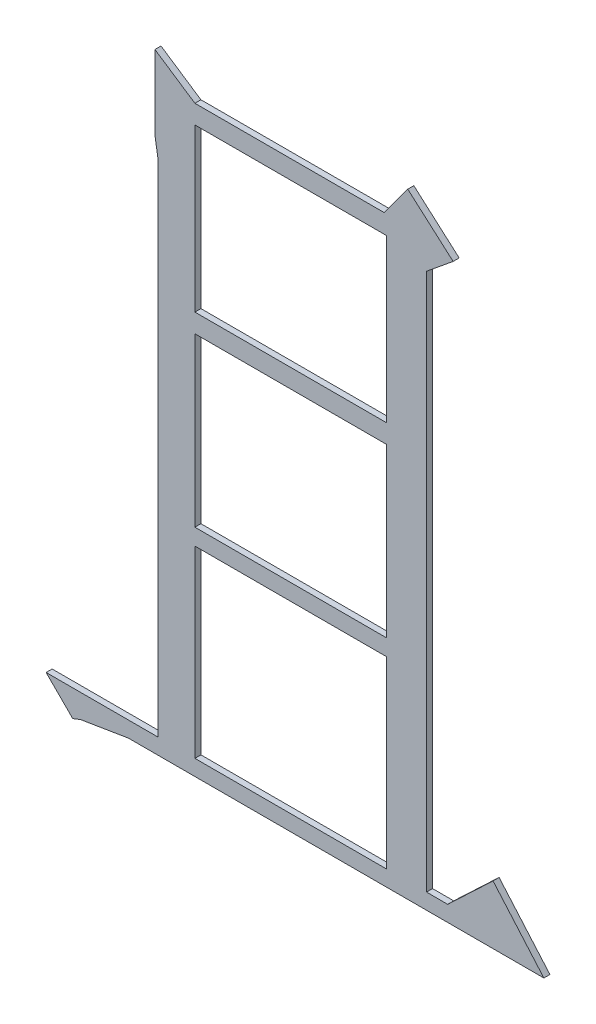
ISO-10303-21;
HEADER;
FILE_DESCRIPTION(('STEP AP214'),'2;1');
FILE_NAME('part.step','',(''),(''),'','','');
FILE_SCHEMA(('AUTOMOTIVE_DESIGN { 1 0 10303 214 1 1 1 1 }'));
ENDSEC;
DATA;
#1=APPLICATION_CONTEXT('core data for automotive mechanical design processes');
#2=APPLICATION_PROTOCOL_DEFINITION('international standard','automotive_design',2000,#1);
#3=PRODUCT_CONTEXT('',#1,'mechanical');
#4=PRODUCT('Part','Part','',(#3));
#5=PRODUCT_RELATED_PRODUCT_CATEGORY('part','',(#4));
#6=PRODUCT_DEFINITION_FORMATION('','',#4);
#7=PRODUCT_DEFINITION_CONTEXT('part definition',#1,'design');
#8=PRODUCT_DEFINITION('design','',#6,#7);
#9=PRODUCT_DEFINITION_SHAPE('','',#8);
#10=(LENGTH_UNIT() NAMED_UNIT(*) SI_UNIT(.MILLI.,.METRE.));
#11=(NAMED_UNIT(*) PLANE_ANGLE_UNIT() SI_UNIT($,.RADIAN.));
#12=(NAMED_UNIT(*) SI_UNIT($,.STERADIAN.) SOLID_ANGLE_UNIT());
#13=UNCERTAINTY_MEASURE_WITH_UNIT(LENGTH_MEASURE(1.E-05),#10,'distance_accuracy_value','');
#14=(GEOMETRIC_REPRESENTATION_CONTEXT(3) GLOBAL_UNCERTAINTY_ASSIGNED_CONTEXT((#13)) GLOBAL_UNIT_ASSIGNED_CONTEXT((#10,
#11,#12)) REPRESENTATION_CONTEXT('',''));
#15=CARTESIAN_POINT('',(0.,0.,0.));
#16=DIRECTION('',(0.,0.,1.));
#17=DIRECTION('',(1.,0.,0.));
#18=AXIS2_PLACEMENT_3D('',#15,#16,#17);
#19=CARTESIAN_POINT('',(0.,0.,0.01));
#20=DIRECTION('',(0.,0.,1.));
#21=DIRECTION('',(1.,0.,0.));
#22=AXIS2_PLACEMENT_3D('',#19,#20,#21);
#23=PLANE('',#22);
#24=DIRECTION('',(1.,0.,0.));
#25=VECTOR('',#24,1.);
#26=CARTESIAN_POINT('',(1.623,-0.015,0.01));
#27=LINE('',#26,#25);
#28=CARTESIAN_POINT('',(1.306,-0.015,0.01));
#29=VERTEX_POINT('',#28);
#30=CARTESIAN_POINT('',(1.623,-0.015,0.01));
#31=VERTEX_POINT('',#30);
#32=EDGE_CURVE('E335',#29,#31,#27,.T.);
#33=ORIENTED_EDGE('',*,*,#32,.F.);
#34=DIRECTION('',(0.,1.,0.));
#35=VECTOR('',#34,1.);
#36=CARTESIAN_POINT('',(1.306,-0.015,0.01));
#37=LINE('',#36,#35);
#38=CARTESIAN_POINT('',(1.306,0.262,0.01));
#39=VERTEX_POINT('',#38);
#40=EDGE_CURVE('E322',#39,#29,#37,.F.);
#41=ORIENTED_EDGE('',*,*,#40,.F.);
#42=DIRECTION('',(1.,0.,0.));
#43=VECTOR('',#42,1.);
#44=CARTESIAN_POINT('',(1.306,0.262,0.01));
#45=LINE('',#44,#43);
#46=CARTESIAN_POINT('',(1.623,0.262,0.01));
#47=VERTEX_POINT('',#46);
#48=EDGE_CURVE('E324',#47,#39,#45,.F.);
#49=ORIENTED_EDGE('',*,*,#48,.F.);
#50=DIRECTION('',(0.,1.,0.));
#51=VECTOR('',#50,1.);
#52=CARTESIAN_POINT('',(1.623,0.262,0.01));
#53=LINE('',#52,#51);
#54=EDGE_CURVE('E328',#31,#47,#53,.T.);
#55=ORIENTED_EDGE('',*,*,#54,.F.);
#56=EDGE_LOOP('',(#33,#41,#49,#55));
#57=FACE_BOUND('',#56,.T.);
#58=DIRECTION('',(1.,0.,0.));
#59=VECTOR('',#58,1.);
#60=CARTESIAN_POINT('',(1.623,-0.346,0.01));
#61=LINE('',#60,#59);
#62=CARTESIAN_POINT('',(1.306,-0.346,0.01));
#63=VERTEX_POINT('',#62);
#64=CARTESIAN_POINT('',(1.623,-0.346,0.01));
#65=VERTEX_POINT('',#64);
#66=EDGE_CURVE('E318',#63,#65,#61,.T.);
#67=ORIENTED_EDGE('',*,*,#66,.F.);
#68=DIRECTION('',(0.,1.,0.));
#69=VECTOR('',#68,1.);
#70=CARTESIAN_POINT('',(1.306,-0.346,0.01));
#71=LINE('',#70,#69);
#72=CARTESIAN_POINT('',(1.306,-0.042,0.01));
#73=VERTEX_POINT('',#72);
#74=EDGE_CURVE('E305',#73,#63,#71,.F.);
#75=ORIENTED_EDGE('',*,*,#74,.F.);
#76=DIRECTION('',(1.,0.,0.));
#77=VECTOR('',#76,1.);
#78=CARTESIAN_POINT('',(1.306,-0.042,0.01));
#79=LINE('',#78,#77);
#80=CARTESIAN_POINT('',(1.623,-0.042,0.01));
#81=VERTEX_POINT('',#80);
#82=EDGE_CURVE('E307',#81,#73,#79,.F.);
#83=ORIENTED_EDGE('',*,*,#82,.F.);
#84=DIRECTION('',(0.,1.,0.));
#85=VECTOR('',#84,1.);
#86=CARTESIAN_POINT('',(1.623,-0.042,0.01));
#87=LINE('',#86,#85);
#88=EDGE_CURVE('E311',#65,#81,#87,.T.);
#89=ORIENTED_EDGE('',*,*,#88,.F.);
#90=EDGE_LOOP('',(#67,#75,#83,#89));
#91=FACE_BOUND('',#90,.T.);
#92=DIRECTION('',(1.,0.,0.));
#93=VECTOR('',#92,1.);
#94=CARTESIAN_POINT('',(1.623,0.293,0.01));
#95=LINE('',#94,#93);
#96=CARTESIAN_POINT('',(1.306,0.293,0.01));
#97=VERTEX_POINT('',#96);
#98=CARTESIAN_POINT('',(1.623,0.293,0.01));
#99=VERTEX_POINT('',#98);
#100=EDGE_CURVE('E301',#97,#99,#95,.T.);
#101=ORIENTED_EDGE('',*,*,#100,.F.);
#102=DIRECTION('',(0.,1.,0.));
#103=VECTOR('',#102,1.);
#104=CARTESIAN_POINT('',(1.306,0.293,0.01));
#105=LINE('',#104,#103);
#106=CARTESIAN_POINT('',(1.306,0.561,0.01));
#107=VERTEX_POINT('',#106);
#108=EDGE_CURVE('E288',#107,#97,#105,.F.);
#109=ORIENTED_EDGE('',*,*,#108,.F.);
#110=DIRECTION('',(1.,0.,0.));
#111=VECTOR('',#110,1.);
#112=CARTESIAN_POINT('',(1.306,0.561,0.01));
#113=LINE('',#112,#111);
#114=CARTESIAN_POINT('',(1.623,0.561,0.01));
#115=VERTEX_POINT('',#114);
#116=EDGE_CURVE('E290',#115,#107,#113,.F.);
#117=ORIENTED_EDGE('',*,*,#116,.F.);
#118=DIRECTION('',(0.,1.,0.));
#119=VECTOR('',#118,1.);
#120=CARTESIAN_POINT('',(1.623,0.561,0.01));
#121=LINE('',#120,#119);
#122=EDGE_CURVE('E294',#99,#115,#121,.T.);
#123=ORIENTED_EDGE('',*,*,#122,.F.);
#124=EDGE_LOOP('',(#101,#109,#117,#123));
#125=FACE_BOUND('',#124,.T.);
#126=DIRECTION('',(0.,1.,0.));
#127=VECTOR('',#126,1.);
#128=CARTESIAN_POINT('',(1.689,-0.346,0.01));
#129=LINE('',#128,#127);
#130=CARTESIAN_POINT('',(1.689,0.543,0.01));
#131=VERTEX_POINT('',#130);
#132=CARTESIAN_POINT('',(1.689,-0.346,0.01));
#133=VERTEX_POINT('',#132);
#134=EDGE_CURVE('E220',#131,#133,#129,.F.);
#135=ORIENTED_EDGE('',*,*,#134,.F.);
#136=DIRECTION('',(0.773957299203294,0.633237790257295,0.));
#137=VECTOR('',#136,1.);
#138=CARTESIAN_POINT('',(1.689,0.543,0.01));
#139=LINE('',#138,#137);
#140=CARTESIAN_POINT('',(1.733,0.579000000000001,0.01));
#141=VERTEX_POINT('',#140);
#142=EDGE_CURVE('E20',#141,#131,#139,.F.);
#143=ORIENTED_EDGE('',*,*,#142,.F.);
#144=DIRECTION('',(-0.750713516922787,0.660627894891989,0.));
#145=VECTOR('',#144,1.);
#146=CARTESIAN_POINT('',(1.733,0.579,0.01));
#147=LINE('',#146,#145);
#148=CARTESIAN_POINT('',(1.658,0.644999999999999,0.01));
#149=VERTEX_POINT('',#148);
#150=EDGE_CURVE('E209',#149,#141,#147,.F.);
#151=ORIENTED_EDGE('',*,*,#150,.F.);
#152=DIRECTION('',(-0.592680527647196,-0.805437640135995,0.));
#153=VECTOR('',#152,1.);
#154=CARTESIAN_POINT('',(1.658,0.645,0.01));
#155=LINE('',#154,#153);
#156=CARTESIAN_POINT('',(1.619,0.592,0.01));
#157=VERTEX_POINT('',#156);
#158=EDGE_CURVE('E204',#157,#149,#155,.F.);
#159=ORIENTED_EDGE('',*,*,#158,.F.);
#160=DIRECTION('',(1.,0.,0.));
#161=VECTOR('',#160,1.);
#162=CARTESIAN_POINT('',(1.619,0.592,0.01));
#163=LINE('',#162,#161);
#164=CARTESIAN_POINT('',(1.306,0.592,0.01));
#165=VERTEX_POINT('',#164);
#166=EDGE_CURVE('E231',#165,#157,#163,.T.);
#167=ORIENTED_EDGE('',*,*,#166,.F.);
#168=DIRECTION('',(-0.832050294337844,0.554700196225229,0.));
#169=VECTOR('',#168,1.);
#170=CARTESIAN_POINT('',(1.306,0.592,0.01));
#171=LINE('',#170,#169);
#172=CARTESIAN_POINT('',(1.24,0.636,0.01));
#173=VERTEX_POINT('',#172);
#174=EDGE_CURVE('E235',#173,#165,#171,.F.);
#175=ORIENTED_EDGE('',*,*,#174,.F.);
#176=DIRECTION('',(0.,1.,0.));
#177=VECTOR('',#176,1.);
#178=CARTESIAN_POINT('',(1.24,0.636,0.01));
#179=LINE('',#178,#177);
#180=CARTESIAN_POINT('',(1.24,0.513,0.01));
#181=VERTEX_POINT('',#180);
#182=EDGE_CURVE('E239',#181,#173,#179,.T.);
#183=ORIENTED_EDGE('',*,*,#182,.F.);
#184=DIRECTION('',(0.159232438824608,-0.987241120712649,0.));
#185=VECTOR('',#184,1.);
#186=CARTESIAN_POINT('',(1.24,0.513,0.01));
#187=LINE('',#186,#185);
#188=CARTESIAN_POINT('',(1.245,0.481999999999999,0.01));
#189=VERTEX_POINT('',#188);
#190=EDGE_CURVE('E243',#189,#181,#187,.F.);
#191=ORIENTED_EDGE('',*,*,#190,.F.);
#192=DIRECTION('',(0.,1.,0.));
#193=VECTOR('',#192,1.);
#194=CARTESIAN_POINT('',(1.245,0.482,0.01));
#195=LINE('',#194,#193);
#196=CARTESIAN_POINT('',(1.245,-0.346,0.01));
#197=VERTEX_POINT('',#196);
#198=EDGE_CURVE('E247',#197,#189,#195,.T.);
#199=ORIENTED_EDGE('',*,*,#198,.F.);
#200=DIRECTION('',(1.,0.,0.));
#201=VECTOR('',#200,1.);
#202=CARTESIAN_POINT('',(1.245,-0.346,0.01));
#203=LINE('',#202,#201);
#204=CARTESIAN_POINT('',(1.06,-0.346,0.01));
#205=VERTEX_POINT('',#204);
#206=EDGE_CURVE('E251',#205,#197,#203,.T.);
#207=ORIENTED_EDGE('',*,*,#206,.F.);
#208=DIRECTION('',(0.707106781186548,-0.707106781186548,0.));
#209=VECTOR('',#208,1.);
#210=CARTESIAN_POINT('',(1.06,-0.346,0.01));
#211=LINE('',#210,#209);
#212=CARTESIAN_POINT('',(1.104,-0.39,0.01));
#213=VERTEX_POINT('',#212);
#214=EDGE_CURVE('E255',#213,#205,#211,.F.);
#215=ORIENTED_EDGE('',*,*,#214,.F.);
#216=DIRECTION('',(0.933345606203054,0.358979079308882,0.));
#217=VECTOR('',#216,1.);
#218=CARTESIAN_POINT('',(1.104,-0.39,0.01));
#219=LINE('',#218,#217);
#220=CARTESIAN_POINT('',(1.117,-0.385,0.01));
#221=VERTEX_POINT('',#220);
#222=EDGE_CURVE('E259',#221,#213,#219,.F.);
#223=ORIENTED_EDGE('',*,*,#222,.F.);
#224=DIRECTION('',(0.986729418532675,0.162373195454696,0.));
#225=VECTOR('',#224,1.);
#226=CARTESIAN_POINT('',(1.117,-0.385,0.01));
#227=LINE('',#226,#225);
#228=CARTESIAN_POINT('',(1.196,-0.372000000000001,0.01));
#229=VERTEX_POINT('',#228);
#230=EDGE_CURVE('E263',#229,#221,#227,.F.);
#231=ORIENTED_EDGE('',*,*,#230,.F.);
#232=DIRECTION('',(1.,0.,0.));
#233=VECTOR('',#232,1.);
#234=CARTESIAN_POINT('',(1.196,-0.372,0.01));
#235=LINE('',#234,#233);
#236=CARTESIAN_POINT('',(1.883,-0.372,0.01));
#237=VERTEX_POINT('',#236);
#238=EDGE_CURVE('E267',#237,#229,#235,.F.);
#239=ORIENTED_EDGE('',*,*,#238,.F.);
#240=DIRECTION('',(-0.654633790246101,0.755946162546001,0.));
#241=VECTOR('',#240,1.);
#242=CARTESIAN_POINT('',(1.883,-0.372,0.01));
#243=LINE('',#242,#241);
#244=CARTESIAN_POINT('',(1.799,-0.275000000000001,0.01));
#245=VERTEX_POINT('',#244);
#246=EDGE_CURVE('E271',#245,#237,#243,.F.);
#247=ORIENTED_EDGE('',*,*,#246,.F.);
#248=DIRECTION('',(-0.726207071739484,-0.687476027913384,0.));
#249=VECTOR('',#248,1.);
#250=CARTESIAN_POINT('',(1.799,-0.275,0.01));
#251=LINE('',#250,#249);
#252=CARTESIAN_POINT('',(1.724,-0.346,0.01));
#253=VERTEX_POINT('',#252);
#254=EDGE_CURVE('E275',#253,#245,#251,.F.);
#255=ORIENTED_EDGE('',*,*,#254,.F.);
#256=DIRECTION('',(1.,0.,0.));
#257=VECTOR('',#256,1.);
#258=CARTESIAN_POINT('',(1.724,-0.346,0.01));
#259=LINE('',#258,#257);
#260=EDGE_CURVE('E279',#133,#253,#259,.T.);
#261=ORIENTED_EDGE('',*,*,#260,.F.);
#262=EDGE_LOOP('',(#135,#143,#151,#159,#167,#175,#183,#191,#199,#207,#215,#223,#231,#239,#247,
#255,#261));
#263=FACE_BOUND('',#262,.T.);
#264=ADVANCED_FACE('F17',(#57,#91,#125,#263),#23,.T.);
#265=CARTESIAN_POINT('',(1.689,0.543,0.));
#266=DIRECTION('',(0.633237790257295,-0.773957299203294,0.));
#267=DIRECTION('',(0.773957299203294,0.633237790257295,0.));
#268=AXIS2_PLACEMENT_3D('',#265,#266,#267);
#269=PLANE('',#268);
#270=DIRECTION('',(0.,0.,-1.));
#271=VECTOR('',#270,1.);
#272=CARTESIAN_POINT('',(1.689,0.543,0.));
#273=LINE('',#272,#271);
#274=CARTESIAN_POINT('',(1.689,0.543,0.));
#275=VERTEX_POINT('',#274);
#276=EDGE_CURVE('E283',#275,#131,#273,.F.);
#277=ORIENTED_EDGE('',*,*,#276,.F.);
#278=DIRECTION('',(0.773957299203322,0.633237790257262,0.));
#279=VECTOR('',#278,1.);
#280=CARTESIAN_POINT('',(1.689,0.543,0.));
#281=LINE('',#280,#279);
#282=CARTESIAN_POINT('',(1.733,0.579000000000001,0.));
#283=VERTEX_POINT('',#282);
#284=EDGE_CURVE('E226',#275,#283,#281,.T.);
#285=ORIENTED_EDGE('',*,*,#284,.T.);
#286=DIRECTION('',(0.,0.,1.));
#287=VECTOR('',#286,1.);
#288=CARTESIAN_POINT('',(1.733,0.579,0.));
#289=LINE('',#288,#287);
#290=EDGE_CURVE('E214',#141,#283,#289,.F.);
#291=ORIENTED_EDGE('',*,*,#290,.F.);
#292=ORIENTED_EDGE('',*,*,#142,.T.);
#293=EDGE_LOOP('',(#277,#285,#291,#292));
#294=FACE_BOUND('',#293,.T.);
#295=ADVANCED_FACE('F225',(#294),#269,.T.);
#296=CARTESIAN_POINT('',(1.733,0.579,0.));
#297=DIRECTION('',(0.660627894891989,0.750713516922787,0.));
#298=DIRECTION('',(-0.750713516922787,0.660627894891989,0.));
#299=AXIS2_PLACEMENT_3D('',#296,#297,#298);
#300=PLANE('',#299);
#301=ORIENTED_EDGE('',*,*,#290,.T.);
#302=DIRECTION('',(-0.750713516922756,0.660627894892024,0.));
#303=VECTOR('',#302,1.);
#304=CARTESIAN_POINT('',(1.733,0.579,0.));
#305=LINE('',#304,#303);
#306=CARTESIAN_POINT('',(1.658,0.644999999999998,0.));
#307=VERTEX_POINT('',#306);
#308=EDGE_CURVE('E339',#283,#307,#305,.T.);
#309=ORIENTED_EDGE('',*,*,#308,.T.);
#310=DIRECTION('',(0.,0.,1.));
#311=VECTOR('',#310,1.);
#312=CARTESIAN_POINT('',(1.658,0.645,0.));
#313=LINE('',#312,#311);
#314=EDGE_CURVE('E216',#149,#307,#313,.F.);
#315=ORIENTED_EDGE('',*,*,#314,.F.);
#316=ORIENTED_EDGE('',*,*,#150,.T.);
#317=EDGE_LOOP('',(#301,#309,#315,#316));
#318=FACE_BOUND('',#317,.T.);
#319=ADVANCED_FACE('F211',(#318),#300,.T.);
#320=CARTESIAN_POINT('',(1.658,0.645,0.));
#321=DIRECTION('',(-0.805437640135995,0.592680527647196,0.));
#322=DIRECTION('',(-0.592680527647196,-0.805437640135995,0.));
#323=AXIS2_PLACEMENT_3D('',#320,#321,#322);
#324=PLANE('',#323);
#325=ORIENTED_EDGE('',*,*,#314,.T.);
#326=DIRECTION('',(-0.592680527647225,-0.805437640135974,0.));
#327=VECTOR('',#326,1.);
#328=CARTESIAN_POINT('',(1.658,0.645,0.));
#329=LINE('',#328,#327);
#330=CARTESIAN_POINT('',(1.619,0.591999999999999,0.));
#331=VERTEX_POINT('',#330);
#332=EDGE_CURVE('E341',#307,#331,#329,.T.);
#333=ORIENTED_EDGE('',*,*,#332,.T.);
#334=DIRECTION('',(0.,0.,1.));
#335=VECTOR('',#334,1.);
#336=CARTESIAN_POINT('',(1.619,0.592,0.));
#337=LINE('',#336,#335);
#338=EDGE_CURVE('E233',#157,#331,#337,.F.);
#339=ORIENTED_EDGE('',*,*,#338,.F.);
#340=ORIENTED_EDGE('',*,*,#158,.T.);
#341=EDGE_LOOP('',(#325,#333,#339,#340));
#342=FACE_BOUND('',#341,.T.);
#343=ADVANCED_FACE('F536',(#342),#324,.T.);
#344=CARTESIAN_POINT('',(1.619,0.592,0.));
#345=DIRECTION('',(0.,1.,0.));
#346=DIRECTION('',(0.,0.,1.));
#347=AXIS2_PLACEMENT_3D('',#344,#345,#346);
#348=PLANE('',#347);
#349=ORIENTED_EDGE('',*,*,#338,.T.);
#350=DIRECTION('',(1.,0.,0.));
#351=VECTOR('',#350,1.);
#352=CARTESIAN_POINT('',(0.,0.592,0.));
#353=LINE('',#352,#351);
#354=CARTESIAN_POINT('',(1.306,0.592,0.));
#355=VERTEX_POINT('',#354);
#356=EDGE_CURVE('E344',#331,#355,#353,.F.);
#357=ORIENTED_EDGE('',*,*,#356,.T.);
#358=DIRECTION('',(0.,0.,1.));
#359=VECTOR('',#358,1.);
#360=CARTESIAN_POINT('',(1.306,0.592,0.));
#361=LINE('',#360,#359);
#362=EDGE_CURVE('E237',#165,#355,#361,.F.);
#363=ORIENTED_EDGE('',*,*,#362,.F.);
#364=ORIENTED_EDGE('',*,*,#166,.T.);
#365=EDGE_LOOP('',(#349,#357,#363,#364));
#366=FACE_BOUND('',#365,.T.);
#367=ADVANCED_FACE('F532',(#366),#348,.T.);
#368=CARTESIAN_POINT('',(1.306,0.592,0.));
#369=DIRECTION('',(0.554700196225229,0.832050294337844,0.));
#370=DIRECTION('',(-0.832050294337844,0.554700196225229,0.));
#371=AXIS2_PLACEMENT_3D('',#368,#369,#370);
#372=PLANE('',#371);
#373=ORIENTED_EDGE('',*,*,#362,.T.);
#374=DIRECTION('',(-0.832050294337843,0.554700196225229,0.));
#375=VECTOR('',#374,1.);
#376=CARTESIAN_POINT('',(1.306,0.592,0.));
#377=LINE('',#376,#375);
#378=CARTESIAN_POINT('',(1.24,0.636,0.));
#379=VERTEX_POINT('',#378);
#380=EDGE_CURVE('E347',#355,#379,#377,.T.);
#381=ORIENTED_EDGE('',*,*,#380,.T.);
#382=DIRECTION('',(0.,0.,1.));
#383=VECTOR('',#382,1.);
#384=CARTESIAN_POINT('',(1.24,0.636,0.));
#385=LINE('',#384,#383);
#386=EDGE_CURVE('E241',#173,#379,#385,.F.);
#387=ORIENTED_EDGE('',*,*,#386,.F.);
#388=ORIENTED_EDGE('',*,*,#174,.T.);
#389=EDGE_LOOP('',(#373,#381,#387,#388));
#390=FACE_BOUND('',#389,.T.);
#391=ADVANCED_FACE('F528',(#390),#372,.T.);
#392=CARTESIAN_POINT('',(1.24,0.636,0.));
#393=DIRECTION('',(-1.,0.,0.));
#394=DIRECTION('',(0.,0.,1.));
#395=AXIS2_PLACEMENT_3D('',#392,#393,#394);
#396=PLANE('',#395);
#397=ORIENTED_EDGE('',*,*,#386,.T.);
#398=DIRECTION('',(0.,1.,0.));
#399=VECTOR('',#398,1.);
#400=CARTESIAN_POINT('',(1.24,0.,0.));
#401=LINE('',#400,#399);
#402=CARTESIAN_POINT('',(1.24,0.513,0.));
#403=VERTEX_POINT('',#402);
#404=EDGE_CURVE('E350',#379,#403,#401,.F.);
#405=ORIENTED_EDGE('',*,*,#404,.T.);
#406=DIRECTION('',(0.,0.,1.));
#407=VECTOR('',#406,1.);
#408=CARTESIAN_POINT('',(1.24,0.513,0.));
#409=LINE('',#408,#407);
#410=EDGE_CURVE('E245',#181,#403,#409,.F.);
#411=ORIENTED_EDGE('',*,*,#410,.F.);
#412=ORIENTED_EDGE('',*,*,#182,.T.);
#413=EDGE_LOOP('',(#397,#405,#411,#412));
#414=FACE_BOUND('',#413,.T.);
#415=ADVANCED_FACE('F524',(#414),#396,.T.);
#416=CARTESIAN_POINT('',(1.24,0.513,0.));
#417=DIRECTION('',(-0.987241120712649,-0.159232438824608,0.));
#418=DIRECTION('',(0.159232438824608,-0.987241120712649,0.));
#419=AXIS2_PLACEMENT_3D('',#416,#417,#418);
#420=PLANE('',#419);
#421=ORIENTED_EDGE('',*,*,#410,.T.);
#422=DIRECTION('',(0.159232438824628,-0.987241120712646,0.));
#423=VECTOR('',#422,1.);
#424=CARTESIAN_POINT('',(1.24,0.513,0.));
#425=LINE('',#424,#423);
#426=CARTESIAN_POINT('',(1.245,0.482,0.));
#427=VERTEX_POINT('',#426);
#428=EDGE_CURVE('E353',#403,#427,#425,.T.);
#429=ORIENTED_EDGE('',*,*,#428,.T.);
#430=DIRECTION('',(0.,0.,1.));
#431=VECTOR('',#430,1.);
#432=CARTESIAN_POINT('',(1.245,0.482,0.));
#433=LINE('',#432,#431);
#434=EDGE_CURVE('E249',#189,#427,#433,.F.);
#435=ORIENTED_EDGE('',*,*,#434,.F.);
#436=ORIENTED_EDGE('',*,*,#190,.T.);
#437=EDGE_LOOP('',(#421,#429,#435,#436));
#438=FACE_BOUND('',#437,.T.);
#439=ADVANCED_FACE('F520',(#438),#420,.T.);
#440=CARTESIAN_POINT('',(1.245,0.482,0.));
#441=DIRECTION('',(-1.,0.,0.));
#442=DIRECTION('',(0.,0.,1.));
#443=AXIS2_PLACEMENT_3D('',#440,#441,#442);
#444=PLANE('',#443);
#445=ORIENTED_EDGE('',*,*,#434,.T.);
#446=DIRECTION('',(0.,1.,0.));
#447=VECTOR('',#446,1.);
#448=CARTESIAN_POINT('',(1.245,0.,0.));
#449=LINE('',#448,#447);
#450=CARTESIAN_POINT('',(1.245,-0.346,0.));
#451=VERTEX_POINT('',#450);
#452=EDGE_CURVE('E356',#427,#451,#449,.F.);
#453=ORIENTED_EDGE('',*,*,#452,.T.);
#454=DIRECTION('',(0.,0.,1.));
#455=VECTOR('',#454,1.);
#456=CARTESIAN_POINT('',(1.245,-0.346,0.));
#457=LINE('',#456,#455);
#458=EDGE_CURVE('E253',#197,#451,#457,.F.);
#459=ORIENTED_EDGE('',*,*,#458,.F.);
#460=ORIENTED_EDGE('',*,*,#198,.T.);
#461=EDGE_LOOP('',(#445,#453,#459,#460));
#462=FACE_BOUND('',#461,.T.);
#463=ADVANCED_FACE('F516',(#462),#444,.T.);
#464=CARTESIAN_POINT('',(1.245,-0.346,0.));
#465=DIRECTION('',(0.,1.,0.));
#466=DIRECTION('',(0.,0.,1.));
#467=AXIS2_PLACEMENT_3D('',#464,#465,#466);
#468=PLANE('',#467);
#469=ORIENTED_EDGE('',*,*,#458,.T.);
#470=DIRECTION('',(1.,0.,0.));
#471=VECTOR('',#470,1.);
#472=CARTESIAN_POINT('',(0.,-0.346,0.));
#473=LINE('',#472,#471);
#474=CARTESIAN_POINT('',(1.06,-0.346,0.));
#475=VERTEX_POINT('',#474);
#476=EDGE_CURVE('E359',#451,#475,#473,.F.);
#477=ORIENTED_EDGE('',*,*,#476,.T.);
#478=DIRECTION('',(0.,0.,1.));
#479=VECTOR('',#478,1.);
#480=CARTESIAN_POINT('',(1.06,-0.346,0.));
#481=LINE('',#480,#479);
#482=EDGE_CURVE('E257',#205,#475,#481,.F.);
#483=ORIENTED_EDGE('',*,*,#482,.F.);
#484=ORIENTED_EDGE('',*,*,#206,.T.);
#485=EDGE_LOOP('',(#469,#477,#483,#484));
#486=FACE_BOUND('',#485,.T.);
#487=ADVANCED_FACE('F512',(#486),#468,.T.);
#488=CARTESIAN_POINT('',(1.06,-0.346,0.));
#489=DIRECTION('',(-0.707106781186548,-0.707106781186548,0.));
#490=DIRECTION('',(0.707106781186548,-0.707106781186548,0.));
#491=AXIS2_PLACEMENT_3D('',#488,#489,#490);
#492=PLANE('',#491);
#493=ORIENTED_EDGE('',*,*,#482,.T.);
#494=DIRECTION('',(0.707106781186547,-0.707106781186548,0.));
#495=VECTOR('',#494,1.);
#496=CARTESIAN_POINT('',(1.06,-0.346,0.));
#497=LINE('',#496,#495);
#498=CARTESIAN_POINT('',(1.104,-0.39,0.));
#499=VERTEX_POINT('',#498);
#500=EDGE_CURVE('E362',#475,#499,#497,.T.);
#501=ORIENTED_EDGE('',*,*,#500,.T.);
#502=DIRECTION('',(0.,0.,1.));
#503=VECTOR('',#502,1.);
#504=CARTESIAN_POINT('',(1.104,-0.39,0.));
#505=LINE('',#504,#503);
#506=EDGE_CURVE('E261',#213,#499,#505,.F.);
#507=ORIENTED_EDGE('',*,*,#506,.F.);
#508=ORIENTED_EDGE('',*,*,#214,.T.);
#509=EDGE_LOOP('',(#493,#501,#507,#508));
#510=FACE_BOUND('',#509,.T.);
#511=ADVANCED_FACE('F508',(#510),#492,.T.);
#512=CARTESIAN_POINT('',(1.104,-0.39,0.));
#513=DIRECTION('',(0.358979079308882,-0.933345606203054,0.));
#514=DIRECTION('',(0.933345606203054,0.358979079308882,0.));
#515=AXIS2_PLACEMENT_3D('',#512,#513,#514);
#516=PLANE('',#515);
#517=ORIENTED_EDGE('',*,*,#506,.T.);
#518=DIRECTION('',(0.933345606203057,0.358979079308875,0.));
#519=VECTOR('',#518,1.);
#520=CARTESIAN_POINT('',(1.104,-0.39,0.));
#521=LINE('',#520,#519);
#522=CARTESIAN_POINT('',(1.117,-0.385,0.));
#523=VERTEX_POINT('',#522);
#524=EDGE_CURVE('E365',#499,#523,#521,.T.);
#525=ORIENTED_EDGE('',*,*,#524,.T.);
#526=DIRECTION('',(0.,0.,1.));
#527=VECTOR('',#526,1.);
#528=CARTESIAN_POINT('',(1.117,-0.385,0.));
#529=LINE('',#528,#527);
#530=EDGE_CURVE('E265',#221,#523,#529,.F.);
#531=ORIENTED_EDGE('',*,*,#530,.F.);
#532=ORIENTED_EDGE('',*,*,#222,.T.);
#533=EDGE_LOOP('',(#517,#525,#531,#532));
#534=FACE_BOUND('',#533,.T.);
#535=ADVANCED_FACE('F504',(#534),#516,.T.);
#536=CARTESIAN_POINT('',(1.117,-0.385,0.));
#537=DIRECTION('',(0.162373195454696,-0.986729418532675,0.));
#538=DIRECTION('',(0.986729418532675,0.162373195454696,0.));
#539=AXIS2_PLACEMENT_3D('',#536,#537,#538);
#540=PLANE('',#539);
#541=ORIENTED_EDGE('',*,*,#530,.T.);
#542=DIRECTION('',(0.986729418532667,0.162373195454743,0.));
#543=VECTOR('',#542,1.);
#544=CARTESIAN_POINT('',(1.117,-0.385,0.));
#545=LINE('',#544,#543);
#546=CARTESIAN_POINT('',(1.196,-0.372000000000002,0.));
#547=VERTEX_POINT('',#546);
#548=EDGE_CURVE('E368',#523,#547,#545,.T.);
#549=ORIENTED_EDGE('',*,*,#548,.T.);
#550=DIRECTION('',(0.,0.,-1.));
#551=VECTOR('',#550,1.);
#552=CARTESIAN_POINT('',(1.196,-0.372,0.));
#553=LINE('',#552,#551);
#554=EDGE_CURVE('E269',#229,#547,#553,.T.);
#555=ORIENTED_EDGE('',*,*,#554,.F.);
#556=ORIENTED_EDGE('',*,*,#230,.T.);
#557=EDGE_LOOP('',(#541,#549,#555,#556));
#558=FACE_BOUND('',#557,.T.);
#559=ADVANCED_FACE('F500',(#558),#540,.T.);
#560=CARTESIAN_POINT('',(1.196,-0.372,0.));
#561=DIRECTION('',(0.,-1.,0.));
#562=DIRECTION('',(0.,0.,-1.));
#563=AXIS2_PLACEMENT_3D('',#560,#561,#562);
#564=PLANE('',#563);
#565=ORIENTED_EDGE('',*,*,#554,.T.);
#566=DIRECTION('',(1.,0.,0.));
#567=VECTOR('',#566,1.);
#568=CARTESIAN_POINT('',(0.,-0.372,0.));
#569=LINE('',#568,#567);
#570=CARTESIAN_POINT('',(1.883,-0.372,0.));
#571=VERTEX_POINT('',#570);
#572=EDGE_CURVE('E371',#547,#571,#569,.T.);
#573=ORIENTED_EDGE('',*,*,#572,.T.);
#574=DIRECTION('',(0.,0.,1.));
#575=VECTOR('',#574,1.);
#576=CARTESIAN_POINT('',(1.883,-0.372,0.));
#577=LINE('',#576,#575);
#578=EDGE_CURVE('E273',#237,#571,#577,.F.);
#579=ORIENTED_EDGE('',*,*,#578,.F.);
#580=ORIENTED_EDGE('',*,*,#238,.T.);
#581=EDGE_LOOP('',(#565,#573,#579,#580));
#582=FACE_BOUND('',#581,.T.);
#583=ADVANCED_FACE('F496',(#582),#564,.T.);
#584=CARTESIAN_POINT('',(1.883,-0.372,0.));
#585=DIRECTION('',(0.755946162546001,0.654633790246101,0.));
#586=DIRECTION('',(-0.654633790246101,0.755946162546001,0.));
#587=AXIS2_PLACEMENT_3D('',#584,#585,#586);
#588=PLANE('',#587);
#589=ORIENTED_EDGE('',*,*,#578,.T.);
#590=DIRECTION('',(-0.654633790246056,0.75594616254604,0.));
#591=VECTOR('',#590,1.);
#592=CARTESIAN_POINT('',(1.883,-0.372,0.));
#593=LINE('',#592,#591);
#594=CARTESIAN_POINT('',(1.799,-0.275000000000002,0.));
#595=VERTEX_POINT('',#594);
#596=EDGE_CURVE('E374',#571,#595,#593,.T.);
#597=ORIENTED_EDGE('',*,*,#596,.T.);
#598=DIRECTION('',(0.,0.,1.));
#599=VECTOR('',#598,1.);
#600=CARTESIAN_POINT('',(1.799,-0.275,0.));
#601=LINE('',#600,#599);
#602=EDGE_CURVE('E277',#245,#595,#601,.F.);
#603=ORIENTED_EDGE('',*,*,#602,.F.);
#604=ORIENTED_EDGE('',*,*,#246,.T.);
#605=EDGE_LOOP('',(#589,#597,#603,#604));
#606=FACE_BOUND('',#605,.T.);
#607=ADVANCED_FACE('F492',(#606),#588,.T.);
#608=CARTESIAN_POINT('',(1.799,-0.275,0.));
#609=DIRECTION('',(-0.687476027913384,0.726207071739484,0.));
#610=DIRECTION('',(-0.726207071739484,-0.687476027913384,0.));
#611=AXIS2_PLACEMENT_3D('',#608,#609,#610);
#612=PLANE('',#611);
#613=ORIENTED_EDGE('',*,*,#602,.T.);
#614=DIRECTION('',(-0.726207071739487,-0.687476027913381,0.));
#615=VECTOR('',#614,1.);
#616=CARTESIAN_POINT('',(1.799,-0.275,0.));
#617=LINE('',#616,#615);
#618=CARTESIAN_POINT('',(1.724,-0.346,0.));
#619=VERTEX_POINT('',#618);
#620=EDGE_CURVE('E377',#595,#619,#617,.T.);
#621=ORIENTED_EDGE('',*,*,#620,.T.);
#622=DIRECTION('',(0.,0.,1.));
#623=VECTOR('',#622,1.);
#624=CARTESIAN_POINT('',(1.724,-0.346,0.));
#625=LINE('',#624,#623);
#626=EDGE_CURVE('E281',#253,#619,#625,.F.);
#627=ORIENTED_EDGE('',*,*,#626,.F.);
#628=ORIENTED_EDGE('',*,*,#254,.T.);
#629=EDGE_LOOP('',(#613,#621,#627,#628));
#630=FACE_BOUND('',#629,.T.);
#631=ADVANCED_FACE('F488',(#630),#612,.T.);
#632=CARTESIAN_POINT('',(1.724,-0.346,0.));
#633=DIRECTION('',(0.,1.,0.));
#634=DIRECTION('',(0.,0.,1.));
#635=AXIS2_PLACEMENT_3D('',#632,#633,#634);
#636=PLANE('',#635);
#637=ORIENTED_EDGE('',*,*,#626,.T.);
#638=DIRECTION('',(1.,0.,0.));
#639=VECTOR('',#638,1.);
#640=CARTESIAN_POINT('',(0.,-0.346,0.));
#641=LINE('',#640,#639);
#642=CARTESIAN_POINT('',(1.689,-0.346,0.));
#643=VERTEX_POINT('',#642);
#644=EDGE_CURVE('E380',#619,#643,#641,.F.);
#645=ORIENTED_EDGE('',*,*,#644,.T.);
#646=DIRECTION('',(0.,0.,-1.));
#647=VECTOR('',#646,1.);
#648=CARTESIAN_POINT('',(1.689,-0.346,0.));
#649=LINE('',#648,#647);
#650=EDGE_CURVE('E286',#133,#643,#649,.T.);
#651=ORIENTED_EDGE('',*,*,#650,.F.);
#652=ORIENTED_EDGE('',*,*,#260,.T.);
#653=EDGE_LOOP('',(#637,#645,#651,#652));
#654=FACE_BOUND('',#653,.T.);
#655=ADVANCED_FACE('F484',(#654),#636,.T.);
#656=CARTESIAN_POINT('',(1.689,-0.346,0.));
#657=DIRECTION('',(1.,0.,0.));
#658=DIRECTION('',(0.,0.,-1.));
#659=AXIS2_PLACEMENT_3D('',#656,#657,#658);
#660=PLANE('',#659);
#661=ORIENTED_EDGE('',*,*,#650,.T.);
#662=DIRECTION('',(0.,1.,0.));
#663=VECTOR('',#662,1.);
#664=CARTESIAN_POINT('',(1.689,0.,0.));
#665=LINE('',#664,#663);
#666=EDGE_CURVE('E383',#643,#275,#665,.T.);
#667=ORIENTED_EDGE('',*,*,#666,.T.);
#668=ORIENTED_EDGE('',*,*,#276,.T.);
#669=ORIENTED_EDGE('',*,*,#134,.T.);
#670=EDGE_LOOP('',(#661,#667,#668,#669));
#671=FACE_BOUND('',#670,.T.);
#672=ADVANCED_FACE('F480',(#671),#660,.T.);
#673=CARTESIAN_POINT('',(1.306,0.293,0.));
#674=DIRECTION('',(1.,0.,0.));
#675=DIRECTION('',(0.,0.,-1.));
#676=AXIS2_PLACEMENT_3D('',#673,#674,#675);
#677=PLANE('',#676);
#678=DIRECTION('',(0.,0.,1.));
#679=VECTOR('',#678,1.);
#680=CARTESIAN_POINT('',(1.306,0.293,0.));
#681=LINE('',#680,#679);
#682=CARTESIAN_POINT('',(1.306,0.293,0.));
#683=VERTEX_POINT('',#682);
#684=EDGE_CURVE('E298',#683,#97,#681,.T.);
#685=ORIENTED_EDGE('',*,*,#684,.F.);
#686=DIRECTION('',(0.,1.,0.));
#687=VECTOR('',#686,1.);
#688=CARTESIAN_POINT('',(1.306,0.,0.));
#689=LINE('',#688,#687);
#690=CARTESIAN_POINT('',(1.306,0.561,0.));
#691=VERTEX_POINT('',#690);
#692=EDGE_CURVE('E386',#683,#691,#689,.T.);
#693=ORIENTED_EDGE('',*,*,#692,.T.);
#694=DIRECTION('',(0.,0.,-1.));
#695=VECTOR('',#694,1.);
#696=CARTESIAN_POINT('',(1.306,0.561,0.));
#697=LINE('',#696,#695);
#698=EDGE_CURVE('E292',#107,#691,#697,.T.);
#699=ORIENTED_EDGE('',*,*,#698,.F.);
#700=ORIENTED_EDGE('',*,*,#108,.T.);
#701=EDGE_LOOP('',(#685,#693,#699,#700));
#702=FACE_BOUND('',#701,.T.);
#703=ADVANCED_FACE('F476',(#702),#677,.T.);
#704=CARTESIAN_POINT('',(1.306,0.561,0.));
#705=DIRECTION('',(0.,-1.,0.));
#706=DIRECTION('',(0.,0.,-1.));
#707=AXIS2_PLACEMENT_3D('',#704,#705,#706);
#708=PLANE('',#707);
#709=ORIENTED_EDGE('',*,*,#698,.T.);
#710=DIRECTION('',(1.,0.,0.));
#711=VECTOR('',#710,1.);
#712=CARTESIAN_POINT('',(0.,0.561,0.));
#713=LINE('',#712,#711);
#714=CARTESIAN_POINT('',(1.623,0.561,0.));
#715=VERTEX_POINT('',#714);
#716=EDGE_CURVE('E389',#691,#715,#713,.T.);
#717=ORIENTED_EDGE('',*,*,#716,.T.);
#718=DIRECTION('',(0.,0.,1.));
#719=VECTOR('',#718,1.);
#720=CARTESIAN_POINT('',(1.623,0.561,0.));
#721=LINE('',#720,#719);
#722=EDGE_CURVE('E296',#115,#715,#721,.F.);
#723=ORIENTED_EDGE('',*,*,#722,.F.);
#724=ORIENTED_EDGE('',*,*,#116,.T.);
#725=EDGE_LOOP('',(#709,#717,#723,#724));
#726=FACE_BOUND('',#725,.T.);
#727=ADVANCED_FACE('F472',(#726),#708,.T.);
#728=CARTESIAN_POINT('',(1.623,0.561,0.));
#729=DIRECTION('',(-1.,0.,0.));
#730=DIRECTION('',(0.,0.,1.));
#731=AXIS2_PLACEMENT_3D('',#728,#729,#730);
#732=PLANE('',#731);
#733=ORIENTED_EDGE('',*,*,#722,.T.);
#734=DIRECTION('',(0.,1.,0.));
#735=VECTOR('',#734,1.);
#736=CARTESIAN_POINT('',(1.623,0.,0.));
#737=LINE('',#736,#735);
#738=CARTESIAN_POINT('',(1.623,0.293,0.));
#739=VERTEX_POINT('',#738);
#740=EDGE_CURVE('E392',#715,#739,#737,.F.);
#741=ORIENTED_EDGE('',*,*,#740,.T.);
#742=DIRECTION('',(0.,0.,1.));
#743=VECTOR('',#742,1.);
#744=CARTESIAN_POINT('',(1.623,0.293,0.));
#745=LINE('',#744,#743);
#746=EDGE_CURVE('E303',#99,#739,#745,.F.);
#747=ORIENTED_EDGE('',*,*,#746,.F.);
#748=ORIENTED_EDGE('',*,*,#122,.T.);
#749=EDGE_LOOP('',(#733,#741,#747,#748));
#750=FACE_BOUND('',#749,.T.);
#751=ADVANCED_FACE('F468',(#750),#732,.T.);
#752=CARTESIAN_POINT('',(1.623,0.293,0.));
#753=DIRECTION('',(0.,1.,0.));
#754=DIRECTION('',(0.,0.,1.));
#755=AXIS2_PLACEMENT_3D('',#752,#753,#754);
#756=PLANE('',#755);
#757=ORIENTED_EDGE('',*,*,#746,.T.);
#758=DIRECTION('',(1.,0.,0.));
#759=VECTOR('',#758,1.);
#760=CARTESIAN_POINT('',(0.,0.293,0.));
#761=LINE('',#760,#759);
#762=EDGE_CURVE('E395',#739,#683,#761,.F.);
#763=ORIENTED_EDGE('',*,*,#762,.T.);
#764=ORIENTED_EDGE('',*,*,#684,.T.);
#765=ORIENTED_EDGE('',*,*,#100,.T.);
#766=EDGE_LOOP('',(#757,#763,#764,#765));
#767=FACE_BOUND('',#766,.T.);
#768=ADVANCED_FACE('F464',(#767),#756,.T.);
#769=CARTESIAN_POINT('',(1.306,-0.346,0.));
#770=DIRECTION('',(1.,0.,0.));
#771=DIRECTION('',(0.,0.,-1.));
#772=AXIS2_PLACEMENT_3D('',#769,#770,#771);
#773=PLANE('',#772);
#774=DIRECTION('',(0.,0.,1.));
#775=VECTOR('',#774,1.);
#776=CARTESIAN_POINT('',(1.306,-0.346,0.));
#777=LINE('',#776,#775);
#778=CARTESIAN_POINT('',(1.306,-0.346,0.));
#779=VERTEX_POINT('',#778);
#780=EDGE_CURVE('E315',#779,#63,#777,.T.);
#781=ORIENTED_EDGE('',*,*,#780,.F.);
#782=DIRECTION('',(0.,1.,0.));
#783=VECTOR('',#782,1.);
#784=CARTESIAN_POINT('',(1.306,0.,0.));
#785=LINE('',#784,#783);
#786=CARTESIAN_POINT('',(1.306,-0.042,0.));
#787=VERTEX_POINT('',#786);
#788=EDGE_CURVE('E398',#779,#787,#785,.T.);
#789=ORIENTED_EDGE('',*,*,#788,.T.);
#790=DIRECTION('',(0.,0.,-1.));
#791=VECTOR('',#790,1.);
#792=CARTESIAN_POINT('',(1.306,-0.042,0.));
#793=LINE('',#792,#791);
#794=EDGE_CURVE('E309',#73,#787,#793,.T.);
#795=ORIENTED_EDGE('',*,*,#794,.F.);
#796=ORIENTED_EDGE('',*,*,#74,.T.);
#797=EDGE_LOOP('',(#781,#789,#795,#796));
#798=FACE_BOUND('',#797,.T.);
#799=ADVANCED_FACE('F460',(#798),#773,.T.);
#800=CARTESIAN_POINT('',(1.306,-0.042,0.));
#801=DIRECTION('',(0.,-1.,0.));
#802=DIRECTION('',(0.,0.,-1.));
#803=AXIS2_PLACEMENT_3D('',#800,#801,#802);
#804=PLANE('',#803);
#805=ORIENTED_EDGE('',*,*,#794,.T.);
#806=DIRECTION('',(1.,0.,0.));
#807=VECTOR('',#806,1.);
#808=CARTESIAN_POINT('',(0.,-0.042,0.));
#809=LINE('',#808,#807);
#810=CARTESIAN_POINT('',(1.623,-0.042,0.));
#811=VERTEX_POINT('',#810);
#812=EDGE_CURVE('E401',#787,#811,#809,.T.);
#813=ORIENTED_EDGE('',*,*,#812,.T.);
#814=DIRECTION('',(0.,0.,1.));
#815=VECTOR('',#814,1.);
#816=CARTESIAN_POINT('',(1.623,-0.042,0.));
#817=LINE('',#816,#815);
#818=EDGE_CURVE('E313',#81,#811,#817,.F.);
#819=ORIENTED_EDGE('',*,*,#818,.F.);
#820=ORIENTED_EDGE('',*,*,#82,.T.);
#821=EDGE_LOOP('',(#805,#813,#819,#820));
#822=FACE_BOUND('',#821,.T.);
#823=ADVANCED_FACE('F456',(#822),#804,.T.);
#824=CARTESIAN_POINT('',(1.623,-0.042,0.));
#825=DIRECTION('',(-1.,0.,0.));
#826=DIRECTION('',(0.,0.,1.));
#827=AXIS2_PLACEMENT_3D('',#824,#825,#826);
#828=PLANE('',#827);
#829=ORIENTED_EDGE('',*,*,#818,.T.);
#830=DIRECTION('',(0.,1.,0.));
#831=VECTOR('',#830,1.);
#832=CARTESIAN_POINT('',(1.623,0.,0.));
#833=LINE('',#832,#831);
#834=CARTESIAN_POINT('',(1.623,-0.346,0.));
#835=VERTEX_POINT('',#834);
#836=EDGE_CURVE('E404',#811,#835,#833,.F.);
#837=ORIENTED_EDGE('',*,*,#836,.T.);
#838=DIRECTION('',(0.,0.,1.));
#839=VECTOR('',#838,1.);
#840=CARTESIAN_POINT('',(1.623,-0.346,0.));
#841=LINE('',#840,#839);
#842=EDGE_CURVE('E320',#65,#835,#841,.F.);
#843=ORIENTED_EDGE('',*,*,#842,.F.);
#844=ORIENTED_EDGE('',*,*,#88,.T.);
#845=EDGE_LOOP('',(#829,#837,#843,#844));
#846=FACE_BOUND('',#845,.T.);
#847=ADVANCED_FACE('F452',(#846),#828,.T.);
#848=CARTESIAN_POINT('',(1.623,-0.346,0.));
#849=DIRECTION('',(0.,1.,0.));
#850=DIRECTION('',(0.,0.,1.));
#851=AXIS2_PLACEMENT_3D('',#848,#849,#850);
#852=PLANE('',#851);
#853=ORIENTED_EDGE('',*,*,#842,.T.);
#854=DIRECTION('',(1.,0.,0.));
#855=VECTOR('',#854,1.);
#856=CARTESIAN_POINT('',(0.,-0.346,0.));
#857=LINE('',#856,#855);
#858=EDGE_CURVE('E407',#835,#779,#857,.F.);
#859=ORIENTED_EDGE('',*,*,#858,.T.);
#860=ORIENTED_EDGE('',*,*,#780,.T.);
#861=ORIENTED_EDGE('',*,*,#66,.T.);
#862=EDGE_LOOP('',(#853,#859,#860,#861));
#863=FACE_BOUND('',#862,.T.);
#864=ADVANCED_FACE('F449',(#863),#852,.T.);
#865=CARTESIAN_POINT('',(1.306,-0.015,0.));
#866=DIRECTION('',(1.,0.,0.));
#867=DIRECTION('',(0.,0.,-1.));
#868=AXIS2_PLACEMENT_3D('',#865,#866,#867);
#869=PLANE('',#868);
#870=DIRECTION('',(0.,0.,1.));
#871=VECTOR('',#870,1.);
#872=CARTESIAN_POINT('',(1.306,-0.015,0.));
#873=LINE('',#872,#871);
#874=CARTESIAN_POINT('',(1.306,-0.015,0.));
#875=VERTEX_POINT('',#874);
#876=EDGE_CURVE('E332',#875,#29,#873,.T.);
#877=ORIENTED_EDGE('',*,*,#876,.F.);
#878=DIRECTION('',(0.,1.,0.));
#879=VECTOR('',#878,1.);
#880=CARTESIAN_POINT('',(1.306,0.,0.));
#881=LINE('',#880,#879);
#882=CARTESIAN_POINT('',(1.306,0.262,0.));
#883=VERTEX_POINT('',#882);
#884=EDGE_CURVE('E410',#875,#883,#881,.T.);
#885=ORIENTED_EDGE('',*,*,#884,.T.);
#886=DIRECTION('',(0.,0.,-1.));
#887=VECTOR('',#886,1.);
#888=CARTESIAN_POINT('',(1.306,0.262,0.));
#889=LINE('',#888,#887);
#890=EDGE_CURVE('E326',#39,#883,#889,.T.);
#891=ORIENTED_EDGE('',*,*,#890,.F.);
#892=ORIENTED_EDGE('',*,*,#40,.T.);
#893=EDGE_LOOP('',(#877,#885,#891,#892));
#894=FACE_BOUND('',#893,.T.);
#895=ADVANCED_FACE('F432',(#894),#869,.T.);
#896=CARTESIAN_POINT('',(1.306,0.262,0.));
#897=DIRECTION('',(0.,-1.,0.));
#898=DIRECTION('',(0.,0.,-1.));
#899=AXIS2_PLACEMENT_3D('',#896,#897,#898);
#900=PLANE('',#899);
#901=ORIENTED_EDGE('',*,*,#890,.T.);
#902=DIRECTION('',(1.,0.,0.));
#903=VECTOR('',#902,1.);
#904=CARTESIAN_POINT('',(0.,0.262,0.));
#905=LINE('',#904,#903);
#906=CARTESIAN_POINT('',(1.623,0.262,0.));
#907=VERTEX_POINT('',#906);
#908=EDGE_CURVE('E413',#883,#907,#905,.T.);
#909=ORIENTED_EDGE('',*,*,#908,.T.);
#910=DIRECTION('',(0.,0.,1.));
#911=VECTOR('',#910,1.);
#912=CARTESIAN_POINT('',(1.623,0.262,0.));
#913=LINE('',#912,#911);
#914=EDGE_CURVE('E330',#47,#907,#913,.F.);
#915=ORIENTED_EDGE('',*,*,#914,.F.);
#916=ORIENTED_EDGE('',*,*,#48,.T.);
#917=EDGE_LOOP('',(#901,#909,#915,#916));
#918=FACE_BOUND('',#917,.T.);
#919=ADVANCED_FACE('F426',(#918),#900,.T.);
#920=CARTESIAN_POINT('',(1.623,0.262,0.));
#921=DIRECTION('',(-1.,0.,0.));
#922=DIRECTION('',(0.,0.,1.));
#923=AXIS2_PLACEMENT_3D('',#920,#921,#922);
#924=PLANE('',#923);
#925=ORIENTED_EDGE('',*,*,#914,.T.);
#926=DIRECTION('',(0.,1.,0.));
#927=VECTOR('',#926,1.);
#928=CARTESIAN_POINT('',(1.623,0.,0.));
#929=LINE('',#928,#927);
#930=CARTESIAN_POINT('',(1.623,-0.015,0.));
#931=VERTEX_POINT('',#930);
#932=EDGE_CURVE('E26',#907,#931,#929,.F.);
#933=ORIENTED_EDGE('',*,*,#932,.T.);
#934=DIRECTION('',(0.,0.,1.));
#935=VECTOR('',#934,1.);
#936=CARTESIAN_POINT('',(1.623,-0.015,0.));
#937=LINE('',#936,#935);
#938=EDGE_CURVE('E34',#31,#931,#937,.F.);
#939=ORIENTED_EDGE('',*,*,#938,.F.);
#940=ORIENTED_EDGE('',*,*,#54,.T.);
#941=EDGE_LOOP('',(#925,#933,#939,#940));
#942=FACE_BOUND('',#941,.T.);
#943=ADVANCED_FACE('F419',(#942),#924,.T.);
#944=CARTESIAN_POINT('',(1.623,-0.015,0.));
#945=DIRECTION('',(0.,1.,0.));
#946=DIRECTION('',(0.,0.,1.));
#947=AXIS2_PLACEMENT_3D('',#944,#945,#946);
#948=PLANE('',#947);
#949=ORIENTED_EDGE('',*,*,#938,.T.);
#950=DIRECTION('',(1.,0.,0.));
#951=VECTOR('',#950,1.);
#952=CARTESIAN_POINT('',(0.,-0.015,0.));
#953=LINE('',#952,#951);
#954=EDGE_CURVE('E11',#931,#875,#953,.F.);
#955=ORIENTED_EDGE('',*,*,#954,.T.);
#956=ORIENTED_EDGE('',*,*,#876,.T.);
#957=ORIENTED_EDGE('',*,*,#32,.T.);
#958=EDGE_LOOP('',(#949,#955,#956,#957));
#959=FACE_BOUND('',#958,.T.);
#960=ADVANCED_FACE('F434',(#959),#948,.T.);
#961=CARTESIAN_POINT('',(0.,0.,0.));
#962=DIRECTION('',(0.,0.,1.));
#963=DIRECTION('',(1.,0.,0.));
#964=AXIS2_PLACEMENT_3D('',#961,#962,#963);
#965=PLANE('',#964);
#966=ORIENTED_EDGE('',*,*,#932,.F.);
#967=ORIENTED_EDGE('',*,*,#908,.F.);
#968=ORIENTED_EDGE('',*,*,#884,.F.);
#969=ORIENTED_EDGE('',*,*,#954,.F.);
#970=EDGE_LOOP('',(#966,#967,#968,#969));
#971=FACE_BOUND('',#970,.T.);
#972=ORIENTED_EDGE('',*,*,#836,.F.);
#973=ORIENTED_EDGE('',*,*,#812,.F.);
#974=ORIENTED_EDGE('',*,*,#788,.F.);
#975=ORIENTED_EDGE('',*,*,#858,.F.);
#976=EDGE_LOOP('',(#972,#973,#974,#975));
#977=FACE_BOUND('',#976,.T.);
#978=ORIENTED_EDGE('',*,*,#740,.F.);
#979=ORIENTED_EDGE('',*,*,#716,.F.);
#980=ORIENTED_EDGE('',*,*,#692,.F.);
#981=ORIENTED_EDGE('',*,*,#762,.F.);
#982=EDGE_LOOP('',(#978,#979,#980,#981));
#983=FACE_BOUND('',#982,.T.);
#984=ORIENTED_EDGE('',*,*,#644,.F.);
#985=ORIENTED_EDGE('',*,*,#620,.F.);
#986=ORIENTED_EDGE('',*,*,#596,.F.);
#987=ORIENTED_EDGE('',*,*,#572,.F.);
#988=ORIENTED_EDGE('',*,*,#548,.F.);
#989=ORIENTED_EDGE('',*,*,#524,.F.);
#990=ORIENTED_EDGE('',*,*,#500,.F.);
#991=ORIENTED_EDGE('',*,*,#476,.F.);
#992=ORIENTED_EDGE('',*,*,#452,.F.);
#993=ORIENTED_EDGE('',*,*,#428,.F.);
#994=ORIENTED_EDGE('',*,*,#404,.F.);
#995=ORIENTED_EDGE('',*,*,#380,.F.);
#996=ORIENTED_EDGE('',*,*,#356,.F.);
#997=ORIENTED_EDGE('',*,*,#332,.F.);
#998=ORIENTED_EDGE('',*,*,#308,.F.);
#999=ORIENTED_EDGE('',*,*,#284,.F.);
#1000=ORIENTED_EDGE('',*,*,#666,.F.);
#1001=EDGE_LOOP('',(#984,#985,#986,#987,#988,#989,#990,#991,#992,#993,#994,#995,#996,#997,#998,
#999,#1000));
#1002=FACE_BOUND('',#1001,.T.);
#1003=ADVANCED_FACE('F423',(#971,#977,#983,#1002),#965,.F.);
#1004=CLOSED_SHELL('',(#264,#295,#319,#343,#367,#391,#415,#439,#463,#487,#511,#535,#559,#583,
#607,#631,#655,#672,#703,#727,#751,#768,#799,#823,#847,#864,#895,#919,#943,#960,#1003));
#1005=MANIFOLD_SOLID_BREP('B1',#1004);
#1006=ADVANCED_BREP_SHAPE_REPRESENTATION('',(#18,#1005),#14);
#1007=SHAPE_DEFINITION_REPRESENTATION(#9,#1006);
ENDSEC;
END-ISO-10303-21;
